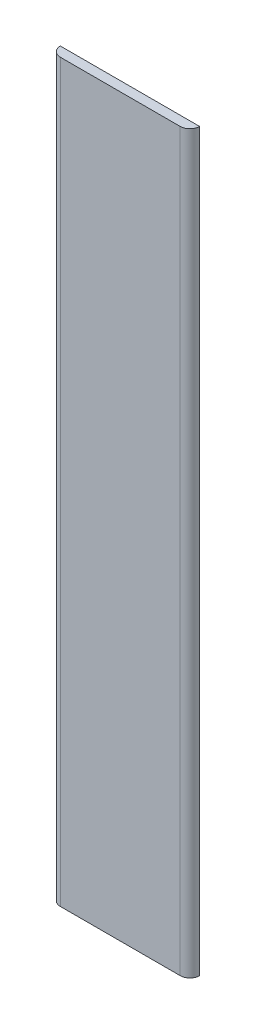
ISO-10303-21;
HEADER;
FILE_DESCRIPTION(('STEP AP214'),'2;1');
FILE_NAME('part.step','',(''),(''),'','','');
FILE_SCHEMA(('AUTOMOTIVE_DESIGN { 1 0 10303 214 1 1 1 1 }'));
ENDSEC;
DATA;
#1=APPLICATION_CONTEXT('core data for automotive mechanical design processes');
#2=APPLICATION_PROTOCOL_DEFINITION('international standard','automotive_design',2000,#1);
#3=PRODUCT_CONTEXT('',#1,'mechanical');
#4=PRODUCT('Part','Part','',(#3));
#5=PRODUCT_RELATED_PRODUCT_CATEGORY('part','',(#4));
#6=PRODUCT_DEFINITION_FORMATION('','',#4);
#7=PRODUCT_DEFINITION_CONTEXT('part definition',#1,'design');
#8=PRODUCT_DEFINITION('design','',#6,#7);
#9=PRODUCT_DEFINITION_SHAPE('','',#8);
#10=(LENGTH_UNIT() NAMED_UNIT(*) SI_UNIT(.MILLI.,.METRE.));
#11=(NAMED_UNIT(*) PLANE_ANGLE_UNIT() SI_UNIT($,.RADIAN.));
#12=(NAMED_UNIT(*) SI_UNIT($,.STERADIAN.) SOLID_ANGLE_UNIT());
#13=UNCERTAINTY_MEASURE_WITH_UNIT(LENGTH_MEASURE(1.E-05),#10,'distance_accuracy_value','');
#14=(GEOMETRIC_REPRESENTATION_CONTEXT(3) GLOBAL_UNCERTAINTY_ASSIGNED_CONTEXT((#13)) GLOBAL_UNIT_ASSIGNED_CONTEXT((#10,
#11,#12)) REPRESENTATION_CONTEXT('',''));
#15=CARTESIAN_POINT('',(0.,0.,0.));
#16=DIRECTION('',(0.,0.,1.));
#17=DIRECTION('',(1.,0.,0.));
#18=AXIS2_PLACEMENT_3D('',#15,#16,#17);
#19=CARTESIAN_POINT('',(-7.25,113.5,-13.));
#20=DIRECTION('',(0.,1.,0.));
#21=DIRECTION('',(0.,0.,1.));
#22=AXIS2_PLACEMENT_3D('',#19,#20,#21);
#23=PLANE('',#22);
#24=DIRECTION('',(1.,0.,0.));
#25=VECTOR('',#24,1.);
#26=CARTESIAN_POINT('',(-7.25,113.5,15.));
#27=LINE('',#26,#25);
#28=CARTESIAN_POINT('',(-10.75,113.5,15.));
#29=VERTEX_POINT('',#28);
#30=CARTESIAN_POINT('',(10.75,113.5,15.));
#31=VERTEX_POINT('',#30);
#32=EDGE_CURVE('E45',#29,#31,#27,.T.);
#33=ORIENTED_EDGE('',*,*,#32,.F.);
#34=CARTESIAN_POINT('',(-9.25,113.5,15.));
#35=DIRECTION('',(0.,1.,0.));
#36=DIRECTION('',(0.,0.,1.));
#37=AXIS2_PLACEMENT_3D('',#34,#35,#36);
#38=CIRCLE('',#37,1.5);
#39=CARTESIAN_POINT('',(-9.25,113.5,16.5));
#40=VERTEX_POINT('',#39);
#41=EDGE_CURVE('E83',#29,#40,#38,.T.);
#42=ORIENTED_EDGE('',*,*,#41,.T.);
#43=DIRECTION('',(1.,0.,0.));
#44=VECTOR('',#43,1.);
#45=CARTESIAN_POINT('',(-9.24999999999999,113.5,16.5));
#46=LINE('',#45,#44);
#47=CARTESIAN_POINT('',(9.24999999999999,113.5,16.5));
#48=VERTEX_POINT('',#47);
#49=EDGE_CURVE('E95',#40,#48,#46,.T.);
#50=ORIENTED_EDGE('',*,*,#49,.T.);
#51=CARTESIAN_POINT('',(9.25,113.5,15.));
#52=DIRECTION('',(0.,1.,0.));
#53=DIRECTION('',(0.,0.,1.));
#54=AXIS2_PLACEMENT_3D('',#51,#52,#53);
#55=CIRCLE('',#54,1.5);
#56=EDGE_CURVE('E85',#48,#31,#55,.T.);
#57=ORIENTED_EDGE('',*,*,#56,.T.);
#58=EDGE_LOOP('',(#33,#42,#50,#57));
#59=FACE_BOUND('',#58,.T.);
#60=ADVANCED_FACE('F41',(#59),#23,.T.);
#61=CARTESIAN_POINT('',(-9.25,113.5,15.));
#62=DIRECTION('',(0.,-1.,0.));
#63=DIRECTION('',(0.,0.,-1.));
#64=AXIS2_PLACEMENT_3D('',#61,#62,#63);
#65=CYLINDRICAL_SURFACE('',#64,1.5);
#66=CARTESIAN_POINT('',(-9.25,0.,15.));
#67=DIRECTION('',(0.,1.,0.));
#68=DIRECTION('',(0.,0.,1.));
#69=AXIS2_PLACEMENT_3D('',#66,#67,#68);
#70=CIRCLE('',#69,1.5);
#71=CARTESIAN_POINT('',(-10.75,0.,15.));
#72=VERTEX_POINT('',#71);
#73=CARTESIAN_POINT('',(-9.25,0.,16.5));
#74=VERTEX_POINT('',#73);
#75=EDGE_CURVE('E104',#72,#74,#70,.T.);
#76=ORIENTED_EDGE('',*,*,#75,.T.);
#77=DIRECTION('',(0.,-1.,0.));
#78=VECTOR('',#77,1.);
#79=CARTESIAN_POINT('',(-9.25,113.5,16.5));
#80=LINE('',#79,#78);
#81=EDGE_CURVE('E90',#40,#74,#80,.T.);
#82=ORIENTED_EDGE('',*,*,#81,.F.);
#83=ORIENTED_EDGE('',*,*,#41,.F.);
#84=DIRECTION('',(0.,-1.,0.));
#85=VECTOR('',#84,1.);
#86=CARTESIAN_POINT('',(-10.75,113.5,15.));
#87=LINE('',#86,#85);
#88=EDGE_CURVE('E86',#29,#72,#87,.T.);
#89=ORIENTED_EDGE('',*,*,#88,.T.);
#90=EDGE_LOOP('',(#76,#82,#83,#89));
#91=FACE_BOUND('',#90,.T.);
#92=ADVANCED_FACE('F92',(#91),#65,.T.);
#93=CARTESIAN_POINT('',(-9.24999999999999,113.5,16.5));
#94=DIRECTION('',(0.,0.,-1.));
#95=DIRECTION('',(-1.,0.,0.));
#96=AXIS2_PLACEMENT_3D('',#93,#94,#95);
#97=PLANE('',#96);
#98=DIRECTION('',(1.,0.,0.));
#99=VECTOR('',#98,1.);
#100=CARTESIAN_POINT('',(-9.24999999999999,0.,16.5));
#101=LINE('',#100,#99);
#102=CARTESIAN_POINT('',(9.24999999999999,0.,16.5));
#103=VERTEX_POINT('',#102);
#104=EDGE_CURVE('E99',#74,#103,#101,.T.);
#105=ORIENTED_EDGE('',*,*,#104,.T.);
#106=DIRECTION('',(0.,-1.,0.));
#107=VECTOR('',#106,1.);
#108=CARTESIAN_POINT('',(9.24999999999999,113.5,16.5));
#109=LINE('',#108,#107);
#110=EDGE_CURVE('E103',#48,#103,#109,.T.);
#111=ORIENTED_EDGE('',*,*,#110,.F.);
#112=ORIENTED_EDGE('',*,*,#49,.F.);
#113=ORIENTED_EDGE('',*,*,#81,.T.);
#114=EDGE_LOOP('',(#105,#111,#112,#113));
#115=FACE_BOUND('',#114,.T.);
#116=ADVANCED_FACE('F111',(#115),#97,.F.);
#117=CARTESIAN_POINT('',(9.25,113.5,15.));
#118=DIRECTION('',(0.,-1.,0.));
#119=DIRECTION('',(0.,0.,-1.));
#120=AXIS2_PLACEMENT_3D('',#117,#118,#119);
#121=CYLINDRICAL_SURFACE('',#120,1.5);
#122=CARTESIAN_POINT('',(9.25,0.,15.));
#123=DIRECTION('',(0.,1.,0.));
#124=DIRECTION('',(0.,0.,1.));
#125=AXIS2_PLACEMENT_3D('',#122,#123,#124);
#126=CIRCLE('',#125,1.5);
#127=CARTESIAN_POINT('',(10.75,0.,15.));
#128=VERTEX_POINT('',#127);
#129=EDGE_CURVE('E96',#103,#128,#126,.T.);
#130=ORIENTED_EDGE('',*,*,#129,.T.);
#131=DIRECTION('',(0.,-1.,0.));
#132=VECTOR('',#131,1.);
#133=CARTESIAN_POINT('',(10.75,113.5,15.));
#134=LINE('',#133,#132);
#135=EDGE_CURVE('E11',#31,#128,#134,.T.);
#136=ORIENTED_EDGE('',*,*,#135,.F.);
#137=ORIENTED_EDGE('',*,*,#56,.F.);
#138=ORIENTED_EDGE('',*,*,#110,.T.);
#139=EDGE_LOOP('',(#130,#136,#137,#138));
#140=FACE_BOUND('',#139,.T.);
#141=ADVANCED_FACE('F115',(#140),#121,.T.);
#142=CARTESIAN_POINT('',(7.25,0.,-13.));
#143=DIRECTION('',(0.,-1.,0.));
#144=DIRECTION('',(0.,0.,-1.));
#145=AXIS2_PLACEMENT_3D('',#142,#143,#144);
#146=PLANE('',#145);
#147=DIRECTION('',(-1.,0.,0.));
#148=VECTOR('',#147,1.);
#149=CARTESIAN_POINT('',(7.25,0.,15.));
#150=LINE('',#149,#148);
#151=EDGE_CURVE('E50',#128,#72,#150,.T.);
#152=ORIENTED_EDGE('',*,*,#151,.F.);
#153=ORIENTED_EDGE('',*,*,#129,.F.);
#154=ORIENTED_EDGE('',*,*,#104,.F.);
#155=ORIENTED_EDGE('',*,*,#75,.F.);
#156=EDGE_LOOP('',(#152,#153,#154,#155));
#157=FACE_BOUND('',#156,.T.);
#158=ADVANCED_FACE('F43',(#157),#146,.T.);
#159=CARTESIAN_POINT('',(-9.25,113.5,15.));
#160=DIRECTION('',(0.,0.,-1.));
#161=DIRECTION('',(-1.,0.,0.));
#162=AXIS2_PLACEMENT_3D('',#159,#160,#161);
#163=PLANE('',#162);
#164=ORIENTED_EDGE('',*,*,#151,.T.);
#165=ORIENTED_EDGE('',*,*,#88,.F.);
#166=ORIENTED_EDGE('',*,*,#32,.T.);
#167=ORIENTED_EDGE('',*,*,#135,.T.);
#168=EDGE_LOOP('',(#164,#165,#166,#167));
#169=FACE_BOUND('',#168,.T.);
#170=ADVANCED_FACE('F87',(#169),#163,.T.);
#171=CLOSED_SHELL('',(#60,#92,#116,#141,#158,#170));
#172=MANIFOLD_SOLID_BREP('B2',#171);
#173=ADVANCED_BREP_SHAPE_REPRESENTATION('',(#18,#172),#14);
#174=SHAPE_DEFINITION_REPRESENTATION(#9,#173);
ENDSEC;
END-ISO-10303-21;
